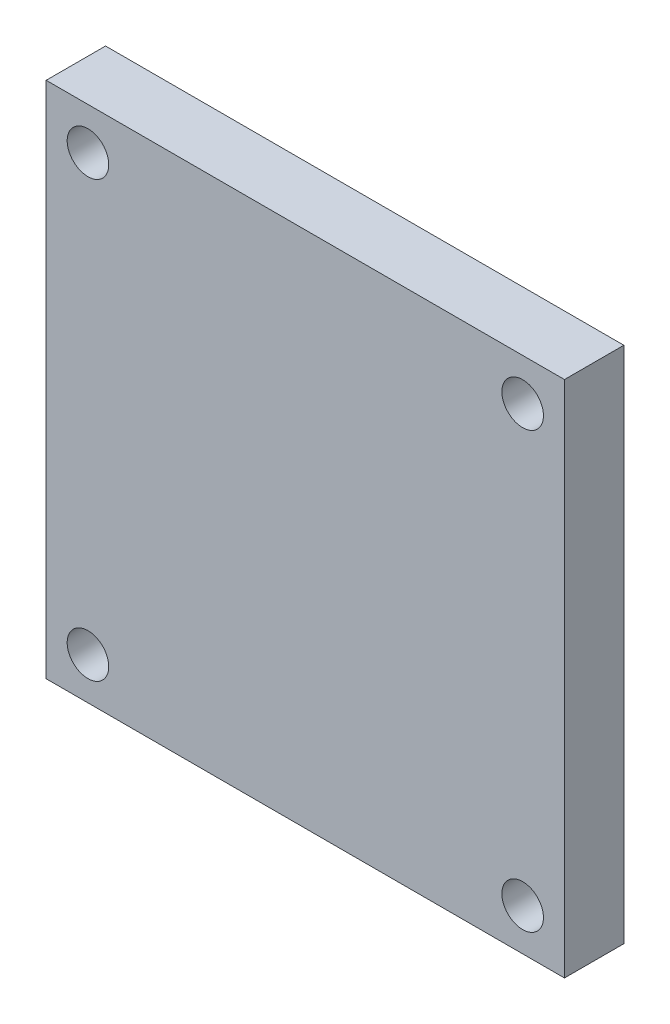
ISO-10303-21;
HEADER;
FILE_DESCRIPTION(('STEP AP214'),'2;1');
FILE_NAME('part.step','',(''),(''),'','','');
FILE_SCHEMA(('AUTOMOTIVE_DESIGN { 1 0 10303 214 1 1 1 1 }'));
ENDSEC;
DATA;
#1=APPLICATION_CONTEXT('core data for automotive mechanical design processes');
#2=APPLICATION_PROTOCOL_DEFINITION('international standard','automotive_design',2000,#1);
#3=PRODUCT_CONTEXT('',#1,'mechanical');
#4=PRODUCT('Part','Part','',(#3));
#5=PRODUCT_RELATED_PRODUCT_CATEGORY('part','',(#4));
#6=PRODUCT_DEFINITION_FORMATION('','',#4);
#7=PRODUCT_DEFINITION_CONTEXT('part definition',#1,'design');
#8=PRODUCT_DEFINITION('design','',#6,#7);
#9=PRODUCT_DEFINITION_SHAPE('','',#8);
#10=(LENGTH_UNIT() NAMED_UNIT(*) SI_UNIT(.MILLI.,.METRE.));
#11=(NAMED_UNIT(*) PLANE_ANGLE_UNIT() SI_UNIT($,.RADIAN.));
#12=(NAMED_UNIT(*) SI_UNIT($,.STERADIAN.) SOLID_ANGLE_UNIT());
#13=UNCERTAINTY_MEASURE_WITH_UNIT(LENGTH_MEASURE(1.E-05),#10,'distance_accuracy_value','');
#14=(GEOMETRIC_REPRESENTATION_CONTEXT(3) GLOBAL_UNCERTAINTY_ASSIGNED_CONTEXT((#13)) GLOBAL_UNIT_ASSIGNED_CONTEXT((#10,
#11,#12)) REPRESENTATION_CONTEXT('',''));
#15=CARTESIAN_POINT('',(0.,0.,0.));
#16=DIRECTION('',(0.,0.,1.));
#17=DIRECTION('',(1.,0.,0.));
#18=AXIS2_PLACEMENT_3D('',#15,#16,#17);
#19=CARTESIAN_POINT('',(0.,0.,5.));
#20=DIRECTION('',(0.,0.,1.));
#21=DIRECTION('',(1.,0.,0.));
#22=AXIS2_PLACEMENT_3D('',#19,#20,#21);
#23=PLANE('',#22);
#24=CARTESIAN_POINT('',(18.3,18.3,5.));
#25=DIRECTION('',(0.,0.,1.));
#26=DIRECTION('',(1.,0.,0.));
#27=AXIS2_PLACEMENT_3D('',#24,#25,#26);
#28=CIRCLE('',#27,1.75);
#29=CARTESIAN_POINT('',(20.05,18.3,5.));
#30=VERTEX_POINT('',#29);
#31=EDGE_CURVE('E142',#30,#30,#28,.T.);
#32=ORIENTED_EDGE('',*,*,#31,.F.);
#33=EDGE_LOOP('',(#32));
#34=FACE_BOUND('',#33,.T.);
#35=CARTESIAN_POINT('',(-18.3,-18.3,5.));
#36=DIRECTION('',(0.,0.,1.));
#37=DIRECTION('',(1.,0.,0.));
#38=AXIS2_PLACEMENT_3D('',#35,#36,#37);
#39=CIRCLE('',#38,1.75);
#40=CARTESIAN_POINT('',(-16.55,-18.3,5.));
#41=VERTEX_POINT('',#40);
#42=EDGE_CURVE('E112',#41,#41,#39,.T.);
#43=ORIENTED_EDGE('',*,*,#42,.F.);
#44=EDGE_LOOP('',(#43));
#45=FACE_BOUND('',#44,.T.);
#46=DIRECTION('',(0.,1.,0.));
#47=VECTOR('',#46,1.);
#48=CARTESIAN_POINT('',(21.82,21.82,5.));
#49=LINE('',#48,#47);
#50=CARTESIAN_POINT('',(21.82,-21.82,5.));
#51=VERTEX_POINT('',#50);
#52=CARTESIAN_POINT('',(21.82,21.82,5.));
#53=VERTEX_POINT('',#52);
#54=EDGE_CURVE('E92',#51,#53,#49,.T.);
#55=ORIENTED_EDGE('',*,*,#54,.T.);
#56=DIRECTION('',(-1.,0.,0.));
#57=VECTOR('',#56,1.);
#58=CARTESIAN_POINT('',(-21.82,21.82,5.));
#59=LINE('',#58,#57);
#60=CARTESIAN_POINT('',(-21.82,21.82,5.));
#61=VERTEX_POINT('',#60);
#62=EDGE_CURVE('E87',#53,#61,#59,.T.);
#63=ORIENTED_EDGE('',*,*,#62,.T.);
#64=DIRECTION('',(0.,-1.,0.));
#65=VECTOR('',#64,1.);
#66=CARTESIAN_POINT('',(-21.82,21.82,5.));
#67=LINE('',#66,#65);
#68=CARTESIAN_POINT('',(-21.82,-21.82,5.));
#69=VERTEX_POINT('',#68);
#70=EDGE_CURVE('E90',#61,#69,#67,.T.);
#71=ORIENTED_EDGE('',*,*,#70,.T.);
#72=DIRECTION('',(1.,0.,0.));
#73=VECTOR('',#72,1.);
#74=CARTESIAN_POINT('',(-21.82,-21.82,5.));
#75=LINE('',#74,#73);
#76=EDGE_CURVE('E57',#69,#51,#75,.T.);
#77=ORIENTED_EDGE('',*,*,#76,.T.);
#78=EDGE_LOOP('',(#55,#63,#71,#77));
#79=FACE_BOUND('',#78,.T.);
#80=CARTESIAN_POINT('',(-18.3,18.3,5.));
#81=DIRECTION('',(0.,0.,1.));
#82=DIRECTION('',(1.,0.,0.));
#83=AXIS2_PLACEMENT_3D('',#80,#81,#82);
#84=CIRCLE('',#83,1.75);
#85=CARTESIAN_POINT('',(-16.55,18.3,5.));
#86=VERTEX_POINT('',#85);
#87=EDGE_CURVE('E134',#86,#86,#84,.T.);
#88=ORIENTED_EDGE('',*,*,#87,.F.);
#89=EDGE_LOOP('',(#88));
#90=FACE_BOUND('',#89,.T.);
#91=CARTESIAN_POINT('',(18.3,-18.3,5.));
#92=DIRECTION('',(0.,0.,1.));
#93=DIRECTION('',(1.,0.,0.));
#94=AXIS2_PLACEMENT_3D('',#91,#92,#93);
#95=CIRCLE('',#94,1.75);
#96=CARTESIAN_POINT('',(20.05,-18.3,5.));
#97=VERTEX_POINT('',#96);
#98=EDGE_CURVE('E150',#97,#97,#95,.T.);
#99=ORIENTED_EDGE('',*,*,#98,.F.);
#100=EDGE_LOOP('',(#99));
#101=FACE_BOUND('',#100,.T.);
#102=ADVANCED_FACE('F39',(#34,#45,#79,#90,#101),#23,.T.);
#103=CARTESIAN_POINT('',(0.,0.,0.));
#104=DIRECTION('',(0.,0.,1.));
#105=DIRECTION('',(1.,0.,0.));
#106=AXIS2_PLACEMENT_3D('',#103,#104,#105);
#107=PLANE('',#106);
#108=DIRECTION('',(0.,1.,0.));
#109=VECTOR('',#108,1.);
#110=CARTESIAN_POINT('',(21.82,21.82,0.));
#111=LINE('',#110,#109);
#112=CARTESIAN_POINT('',(21.82,-21.82,0.));
#113=VERTEX_POINT('',#112);
#114=CARTESIAN_POINT('',(21.82,21.82,0.));
#115=VERTEX_POINT('',#114);
#116=EDGE_CURVE('E108',#113,#115,#111,.T.);
#117=ORIENTED_EDGE('',*,*,#116,.F.);
#118=DIRECTION('',(1.,0.,0.));
#119=VECTOR('',#118,1.);
#120=CARTESIAN_POINT('',(-21.82,-21.82,0.));
#121=LINE('',#120,#119);
#122=CARTESIAN_POINT('',(-21.82,-21.82,0.));
#123=VERTEX_POINT('',#122);
#124=EDGE_CURVE('E80',#123,#113,#121,.T.);
#125=ORIENTED_EDGE('',*,*,#124,.F.);
#126=DIRECTION('',(0.,-1.,0.));
#127=VECTOR('',#126,1.);
#128=CARTESIAN_POINT('',(-21.82,21.82,0.));
#129=LINE('',#128,#127);
#130=CARTESIAN_POINT('',(-21.82,21.82,0.));
#131=VERTEX_POINT('',#130);
#132=EDGE_CURVE('E74',#131,#123,#129,.T.);
#133=ORIENTED_EDGE('',*,*,#132,.F.);
#134=DIRECTION('',(-1.,0.,0.));
#135=VECTOR('',#134,1.);
#136=CARTESIAN_POINT('',(-21.82,21.82,0.));
#137=LINE('',#136,#135);
#138=EDGE_CURVE('E97',#115,#131,#137,.T.);
#139=ORIENTED_EDGE('',*,*,#138,.F.);
#140=EDGE_LOOP('',(#117,#125,#133,#139));
#141=FACE_BOUND('',#140,.T.);
#142=CARTESIAN_POINT('',(-18.3,-18.3,0.));
#143=DIRECTION('',(0.,0.,1.));
#144=DIRECTION('',(1.,0.,0.));
#145=AXIS2_PLACEMENT_3D('',#142,#143,#144);
#146=CIRCLE('',#145,1.75);
#147=CARTESIAN_POINT('',(-16.55,-18.3,0.));
#148=VERTEX_POINT('',#147);
#149=EDGE_CURVE('E130',#148,#148,#146,.T.);
#150=ORIENTED_EDGE('',*,*,#149,.T.);
#151=EDGE_LOOP('',(#150));
#152=FACE_BOUND('',#151,.T.);
#153=CARTESIAN_POINT('',(-18.3,18.3,0.));
#154=DIRECTION('',(0.,0.,1.));
#155=DIRECTION('',(1.,0.,0.));
#156=AXIS2_PLACEMENT_3D('',#153,#154,#155);
#157=CIRCLE('',#156,1.75);
#158=CARTESIAN_POINT('',(-16.55,18.3,0.));
#159=VERTEX_POINT('',#158);
#160=EDGE_CURVE('E138',#159,#159,#157,.T.);
#161=ORIENTED_EDGE('',*,*,#160,.T.);
#162=EDGE_LOOP('',(#161));
#163=FACE_BOUND('',#162,.T.);
#164=CARTESIAN_POINT('',(18.3,18.3,0.));
#165=DIRECTION('',(0.,0.,1.));
#166=DIRECTION('',(1.,0.,0.));
#167=AXIS2_PLACEMENT_3D('',#164,#165,#166);
#168=CIRCLE('',#167,1.75);
#169=CARTESIAN_POINT('',(20.05,18.3,0.));
#170=VERTEX_POINT('',#169);
#171=EDGE_CURVE('E146',#170,#170,#168,.T.);
#172=ORIENTED_EDGE('',*,*,#171,.T.);
#173=EDGE_LOOP('',(#172));
#174=FACE_BOUND('',#173,.T.);
#175=CARTESIAN_POINT('',(18.3,-18.3,0.));
#176=DIRECTION('',(0.,0.,1.));
#177=DIRECTION('',(1.,0.,0.));
#178=AXIS2_PLACEMENT_3D('',#175,#176,#177);
#179=CIRCLE('',#178,1.75);
#180=CARTESIAN_POINT('',(20.05,-18.3,0.));
#181=VERTEX_POINT('',#180);
#182=EDGE_CURVE('E154',#181,#181,#179,.T.);
#183=ORIENTED_EDGE('',*,*,#182,.T.);
#184=EDGE_LOOP('',(#183));
#185=FACE_BOUND('',#184,.T.);
#186=ADVANCED_FACE('F125',(#141,#152,#163,#174,#185),#107,.F.);
#187=CARTESIAN_POINT('',(21.82,21.82,5.));
#188=DIRECTION('',(-1.,0.,0.));
#189=DIRECTION('',(0.,-1.,0.));
#190=AXIS2_PLACEMENT_3D('',#187,#188,#189);
#191=PLANE('',#190);
#192=ORIENTED_EDGE('',*,*,#116,.T.);
#193=DIRECTION('',(0.,0.,-1.));
#194=VECTOR('',#193,1.);
#195=CARTESIAN_POINT('',(21.82,21.82,5.));
#196=LINE('',#195,#194);
#197=EDGE_CURVE('E11',#53,#115,#196,.T.);
#198=ORIENTED_EDGE('',*,*,#197,.F.);
#199=ORIENTED_EDGE('',*,*,#54,.F.);
#200=DIRECTION('',(0.,0.,-1.));
#201=VECTOR('',#200,1.);
#202=CARTESIAN_POINT('',(21.82,-21.82,5.));
#203=LINE('',#202,#201);
#204=EDGE_CURVE('E104',#51,#113,#203,.T.);
#205=ORIENTED_EDGE('',*,*,#204,.T.);
#206=EDGE_LOOP('',(#192,#198,#199,#205));
#207=FACE_BOUND('',#206,.T.);
#208=ADVANCED_FACE('F41',(#207),#191,.F.);
#209=CARTESIAN_POINT('',(-21.82,21.82,5.));
#210=DIRECTION('',(0.,-1.,0.));
#211=DIRECTION('',(0.,0.,-1.));
#212=AXIS2_PLACEMENT_3D('',#209,#210,#211);
#213=PLANE('',#212);
#214=ORIENTED_EDGE('',*,*,#138,.T.);
#215=DIRECTION('',(0.,0.,-1.));
#216=VECTOR('',#215,1.);
#217=CARTESIAN_POINT('',(-21.82,21.82,5.));
#218=LINE('',#217,#216);
#219=EDGE_CURVE('E49',#61,#131,#218,.T.);
#220=ORIENTED_EDGE('',*,*,#219,.F.);
#221=ORIENTED_EDGE('',*,*,#62,.F.);
#222=ORIENTED_EDGE('',*,*,#197,.T.);
#223=EDGE_LOOP('',(#214,#220,#221,#222));
#224=FACE_BOUND('',#223,.T.);
#225=ADVANCED_FACE('F96',(#224),#213,.F.);
#226=CARTESIAN_POINT('',(-21.82,21.82,5.));
#227=DIRECTION('',(1.,0.,0.));
#228=DIRECTION('',(0.,1.,0.));
#229=AXIS2_PLACEMENT_3D('',#226,#227,#228);
#230=PLANE('',#229);
#231=ORIENTED_EDGE('',*,*,#132,.T.);
#232=DIRECTION('',(0.,0.,-1.));
#233=VECTOR('',#232,1.);
#234=CARTESIAN_POINT('',(-21.82,-21.82,5.));
#235=LINE('',#234,#233);
#236=EDGE_CURVE('E99',#69,#123,#235,.T.);
#237=ORIENTED_EDGE('',*,*,#236,.F.);
#238=ORIENTED_EDGE('',*,*,#70,.F.);
#239=ORIENTED_EDGE('',*,*,#219,.T.);
#240=EDGE_LOOP('',(#231,#237,#238,#239));
#241=FACE_BOUND('',#240,.T.);
#242=ADVANCED_FACE('F100',(#241),#230,.F.);
#243=CARTESIAN_POINT('',(-21.82,-21.82,5.));
#244=DIRECTION('',(0.,1.,0.));
#245=DIRECTION('',(0.,0.,1.));
#246=AXIS2_PLACEMENT_3D('',#243,#244,#245);
#247=PLANE('',#246);
#248=ORIENTED_EDGE('',*,*,#124,.T.);
#249=ORIENTED_EDGE('',*,*,#204,.F.);
#250=ORIENTED_EDGE('',*,*,#76,.F.);
#251=ORIENTED_EDGE('',*,*,#236,.T.);
#252=EDGE_LOOP('',(#248,#249,#250,#251));
#253=FACE_BOUND('',#252,.T.);
#254=ADVANCED_FACE('F122',(#253),#247,.F.);
#255=CARTESIAN_POINT('',(-18.3,-18.3,5.));
#256=DIRECTION('',(0.,0.,-1.));
#257=DIRECTION('',(-1.,0.,0.));
#258=AXIS2_PLACEMENT_3D('',#255,#256,#257);
#259=CYLINDRICAL_SURFACE('',#258,1.75);
#260=ORIENTED_EDGE('',*,*,#42,.T.);
#261=EDGE_LOOP('',(#260));
#262=FACE_BOUND('',#261,.T.);
#263=ORIENTED_EDGE('',*,*,#149,.F.);
#264=EDGE_LOOP('',(#263));
#265=FACE_BOUND('',#264,.T.);
#266=ADVANCED_FACE('F175',(#262,#265),#259,.F.);
#267=CARTESIAN_POINT('',(-18.3,18.3,5.));
#268=DIRECTION('',(0.,0.,-1.));
#269=DIRECTION('',(-1.,0.,0.));
#270=AXIS2_PLACEMENT_3D('',#267,#268,#269);
#271=CYLINDRICAL_SURFACE('',#270,1.75);
#272=ORIENTED_EDGE('',*,*,#87,.T.);
#273=EDGE_LOOP('',(#272));
#274=FACE_BOUND('',#273,.T.);
#275=ORIENTED_EDGE('',*,*,#160,.F.);
#276=EDGE_LOOP('',(#275));
#277=FACE_BOUND('',#276,.T.);
#278=ADVANCED_FACE('F221',(#274,#277),#271,.F.);
#279=CARTESIAN_POINT('',(18.3,18.3,5.));
#280=DIRECTION('',(0.,0.,-1.));
#281=DIRECTION('',(-1.,0.,0.));
#282=AXIS2_PLACEMENT_3D('',#279,#280,#281);
#283=CYLINDRICAL_SURFACE('',#282,1.75);
#284=ORIENTED_EDGE('',*,*,#31,.T.);
#285=EDGE_LOOP('',(#284));
#286=FACE_BOUND('',#285,.T.);
#287=ORIENTED_EDGE('',*,*,#171,.F.);
#288=EDGE_LOOP('',(#287));
#289=FACE_BOUND('',#288,.T.);
#290=ADVANCED_FACE('F229',(#286,#289),#283,.F.);
#291=CARTESIAN_POINT('',(18.3,-18.3,5.));
#292=DIRECTION('',(0.,0.,-1.));
#293=DIRECTION('',(-1.,0.,0.));
#294=AXIS2_PLACEMENT_3D('',#291,#292,#293);
#295=CYLINDRICAL_SURFACE('',#294,1.75);
#296=ORIENTED_EDGE('',*,*,#98,.T.);
#297=EDGE_LOOP('',(#296));
#298=FACE_BOUND('',#297,.T.);
#299=ORIENTED_EDGE('',*,*,#182,.F.);
#300=EDGE_LOOP('',(#299));
#301=FACE_BOUND('',#300,.T.);
#302=ADVANCED_FACE('F162',(#298,#301),#295,.F.);
#303=CLOSED_SHELL('',(#102,#186,#208,#225,#242,#254,#266,#278,#290,#302));
#304=MANIFOLD_SOLID_BREP('B2',#303);
#305=ADVANCED_BREP_SHAPE_REPRESENTATION('',(#18,#304),#14);
#306=SHAPE_DEFINITION_REPRESENTATION(#9,#305);
ENDSEC;
END-ISO-10303-21;
